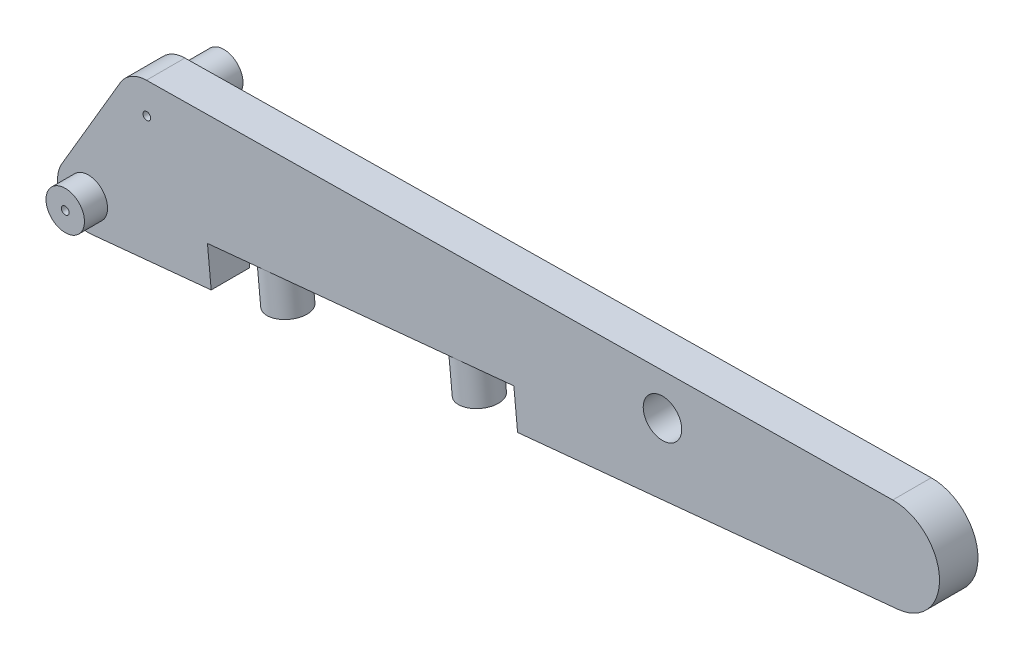
ISO-10303-21;
HEADER;
FILE_DESCRIPTION(('STEP AP214'),'2;1');
FILE_NAME('part.step','',(''),(''),'','','');
FILE_SCHEMA(('AUTOMOTIVE_DESIGN { 1 0 10303 214 1 1 1 1 }'));
ENDSEC;
DATA;
#1=APPLICATION_CONTEXT('core data for automotive mechanical design processes');
#2=APPLICATION_PROTOCOL_DEFINITION('international standard','automotive_design',2000,#1);
#3=PRODUCT_CONTEXT('',#1,'mechanical');
#4=PRODUCT('Part','Part','',(#3));
#5=PRODUCT_RELATED_PRODUCT_CATEGORY('part','',(#4));
#6=PRODUCT_DEFINITION_FORMATION('','',#4);
#7=PRODUCT_DEFINITION_CONTEXT('part definition',#1,'design');
#8=PRODUCT_DEFINITION('design','',#6,#7);
#9=PRODUCT_DEFINITION_SHAPE('','',#8);
#10=(LENGTH_UNIT() NAMED_UNIT(*) SI_UNIT(.MILLI.,.METRE.));
#11=(NAMED_UNIT(*) PLANE_ANGLE_UNIT() SI_UNIT($,.RADIAN.));
#12=(NAMED_UNIT(*) SI_UNIT($,.STERADIAN.) SOLID_ANGLE_UNIT());
#13=UNCERTAINTY_MEASURE_WITH_UNIT(LENGTH_MEASURE(1.E-05),#10,'distance_accuracy_value','');
#14=(GEOMETRIC_REPRESENTATION_CONTEXT(3) GLOBAL_UNCERTAINTY_ASSIGNED_CONTEXT((#13)) GLOBAL_UNIT_ASSIGNED_CONTEXT((#10,
#11,#12)) REPRESENTATION_CONTEXT('',''));
#15=CARTESIAN_POINT('',(0.,0.,0.));
#16=DIRECTION('',(0.,0.,1.));
#17=DIRECTION('',(1.,0.,0.));
#18=AXIS2_PLACEMENT_3D('',#15,#16,#17);
#19=CARTESIAN_POINT('',(47.6890944429912,-6.52502358700781,5.));
#20=DIRECTION('',(-0.0968281530487967,0.995301114626704,0.));
#21=DIRECTION('',(-0.995301114626704,-0.0968281530487967,0.));
#22=AXIS2_PLACEMENT_3D('',#19,#20,#21);
#23=PLANE('',#22);
#24=CARTESIAN_POINT('',(40.2243360832909,-7.25123473487379,2.5));
#25=DIRECTION('',(0.0968281530487967,-0.995301114626704,0.));
#26=DIRECTION('',(0.995301114626704,0.0968281530487967,0.));
#27=AXIS2_PLACEMENT_3D('',#24,#25,#26);
#28=CIRCLE('',#27,2.5);
#29=CARTESIAN_POINT('',(40.2243360832909,-7.25123473487379,0.));
#30=VERTEX_POINT('',#29);
#31=CARTESIAN_POINT('',(40.2243360832909,-7.25123473487379,5.));
#32=VERTEX_POINT('',#31);
#33=EDGE_CURVE('E146',#30,#32,#28,.T.);
#34=ORIENTED_EDGE('',*,*,#33,.F.);
#35=DIRECTION('',(0.995301114626704,0.0968281530487967,0.));
#36=VECTOR('',#35,1.);
#37=CARTESIAN_POINT('',(47.6890944429912,-6.52502358700781,0.));
#38=LINE('',#37,#36);
#39=CARTESIAN_POINT('',(47.6890944429912,-6.52502358700781,0.));
#40=VERTEX_POINT('',#39);
#41=EDGE_CURVE('E133',#30,#40,#38,.T.);
#42=ORIENTED_EDGE('',*,*,#41,.T.);
#43=DIRECTION('',(0.,0.,-1.));
#44=VECTOR('',#43,1.);
#45=CARTESIAN_POINT('',(47.6890944429912,-6.52502358700781,5.));
#46=LINE('',#45,#44);
#47=CARTESIAN_POINT('',(47.6890944429912,-6.52502358700781,5.));
#48=VERTEX_POINT('',#47);
#49=EDGE_CURVE('E182',#48,#40,#46,.T.);
#50=ORIENTED_EDGE('',*,*,#49,.F.);
#51=DIRECTION('',(0.995301114626704,0.0968281530487967,0.));
#52=VECTOR('',#51,1.);
#53=CARTESIAN_POINT('',(47.6890944429912,-6.52502358700781,5.));
#54=LINE('',#53,#52);
#55=EDGE_CURVE('E147',#32,#48,#54,.T.);
#56=ORIENTED_EDGE('',*,*,#55,.F.);
#57=EDGE_LOOP('',(#34,#42,#50,#56));
#58=FACE_BOUND('',#57,.T.);
#59=ADVANCED_FACE('F38',(#58),#23,.F.);
#60=EDGE_CURVE('E53',#32,#30,#28,.T.);
#61=ORIENTED_EDGE('',*,*,#60,.F.);
#62=CARTESIAN_POINT('',(15.3418082176233,-9.6719385610937,5.));
#63=VERTEX_POINT('',#62);
#64=EDGE_CURVE('E178',#63,#32,#54,.T.);
#65=ORIENTED_EDGE('',*,*,#64,.F.);
#66=CARTESIAN_POINT('',(15.3418082176233,-9.6719385610937,2.5));
#67=DIRECTION('',(-0.0968281530487967,0.995301114626704,0.));
#68=DIRECTION('',(-0.995301114626704,-0.0968281530487967,0.));
#69=AXIS2_PLACEMENT_3D('',#66,#67,#68);
#70=CIRCLE('',#69,2.5);
#71=CARTESIAN_POINT('',(15.3418082176233,-9.67193856109371,0.));
#72=VERTEX_POINT('',#71);
#73=EDGE_CURVE('E11',#72,#63,#70,.F.);
#74=ORIENTED_EDGE('',*,*,#73,.F.);
#75=EDGE_CURVE('E127',#72,#30,#38,.T.);
#76=ORIENTED_EDGE('',*,*,#75,.T.);
#77=EDGE_LOOP('',(#61,#65,#74,#76));
#78=FACE_BOUND('',#77,.T.);
#79=ADVANCED_FACE('F129',(#78),#23,.F.);
#80=CARTESIAN_POINT('',(97.5809689182928,-6.71860047068932,5.));
#81=DIRECTION('',(-0.0968281530487968,0.995301114626704,0.));
#82=DIRECTION('',(-0.995301114626704,-0.0968281530487968,0.));
#83=AXIS2_PLACEMENT_3D('',#80,#81,#82);
#84=PLANE('',#83);
#85=DIRECTION('',(0.995301114626704,0.0968281530487968,0.));
#86=VECTOR('',#85,1.);
#87=CARTESIAN_POINT('',(97.5809689182928,-6.71860047068932,5.));
#88=LINE('',#87,#86);
#89=CARTESIAN_POINT('',(48.1755208702595,-11.5250235870078,5.));
#90=VERTEX_POINT('',#89);
#91=CARTESIAN_POINT('',(97.5809689182928,-6.71860047068932,5.));
#92=VERTEX_POINT('',#91);
#93=EDGE_CURVE('E229',#90,#92,#88,.T.);
#94=ORIENTED_EDGE('',*,*,#93,.F.);
#95=DIRECTION('',(0.,0.,-1.));
#96=VECTOR('',#95,1.);
#97=CARTESIAN_POINT('',(48.1755208702595,-11.5250235870078,5.));
#98=LINE('',#97,#96);
#99=CARTESIAN_POINT('',(48.1755208702595,-11.5250235870078,0.));
#100=VERTEX_POINT('',#99);
#101=EDGE_CURVE('E177',#90,#100,#98,.T.);
#102=ORIENTED_EDGE('',*,*,#101,.T.);
#103=DIRECTION('',(0.995301114626704,0.0968281530487968,0.));
#104=VECTOR('',#103,1.);
#105=CARTESIAN_POINT('',(97.5809689182928,-6.71860047068932,0.));
#106=LINE('',#105,#104);
#107=CARTESIAN_POINT('',(97.5809689182928,-6.71860047068932,0.));
#108=VERTEX_POINT('',#107);
#109=EDGE_CURVE('E244',#100,#108,#106,.T.);
#110=ORIENTED_EDGE('',*,*,#109,.T.);
#111=DIRECTION('',(0.,0.,-1.));
#112=VECTOR('',#111,1.);
#113=CARTESIAN_POINT('',(97.5809689182928,-6.71860047068932,5.));
#114=LINE('',#113,#112);
#115=EDGE_CURVE('E256',#92,#108,#114,.T.);
#116=ORIENTED_EDGE('',*,*,#115,.F.);
#117=EDGE_LOOP('',(#94,#102,#110,#116));
#118=FACE_BOUND('',#117,.T.);
#119=ADVANCED_FACE('F299',(#118),#84,.F.);
#120=CARTESIAN_POINT('',(0.,0.,5.));
#121=DIRECTION('',(0.,0.,1.));
#122=DIRECTION('',(1.,0.,0.));
#123=AXIS2_PLACEMENT_3D('',#120,#121,#122);
#124=PLANE('',#123);
#125=DIRECTION('',(0.0968281530487984,-0.995301114626703,0.));
#126=VECTOR('',#125,1.);
#127=CARTESIAN_POINT('',(48.1755208702595,-11.5250235870078,5.));
#128=LINE('',#127,#126);
#129=EDGE_CURVE('E168',#48,#90,#128,.T.);
#130=ORIENTED_EDGE('',*,*,#129,.T.);
#131=ORIENTED_EDGE('',*,*,#93,.T.);
#132=CARTESIAN_POINT('',(97.,-0.746793782929099,5.));
#133=DIRECTION('',(0.,0.,1.));
#134=DIRECTION('',(1.,0.,0.));
#135=AXIS2_PLACEMENT_3D('',#132,#133,#134);
#136=CIRCLE('',#135,6.);
#137=CARTESIAN_POINT('',(96.9224782338776,5.25270539415037,5.));
#138=VERTEX_POINT('',#137);
#139=EDGE_CURVE('E233',#92,#138,#136,.T.);
#140=ORIENTED_EDGE('',*,*,#139,.T.);
#141=DIRECTION('',(-0.999916529513246,-0.0129202943537264,0.));
#142=VECTOR('',#141,1.);
#143=CARTESIAN_POINT('',(-0.0516811774149059,3.99966611805298,5.));
#144=LINE('',#143,#142);
#145=CARTESIAN_POINT('',(-0.0516811774149059,3.99966611805298,5.));
#146=VERTEX_POINT('',#145);
#147=EDGE_CURVE('E235',#138,#146,#144,.T.);
#148=ORIENTED_EDGE('',*,*,#147,.T.);
#149=CARTESIAN_POINT('',(0.,0.,5.));
#150=DIRECTION('',(0.,0.,1.));
#151=DIRECTION('',(1.,0.,0.));
#152=AXIS2_PLACEMENT_3D('',#149,#150,#151);
#153=CIRCLE('',#152,4.);
#154=CARTESIAN_POINT('',(-3.4486016019758,2.02660972830239,5.));
#155=VERTEX_POINT('',#154);
#156=EDGE_CURVE('E221',#146,#155,#153,.T.);
#157=ORIENTED_EDGE('',*,*,#156,.T.);
#158=DIRECTION('',(-0.506652432075599,-0.862150400493951,0.));
#159=VECTOR('',#158,1.);
#160=CARTESIAN_POINT('',(-11.0483880831098,-10.9056462791069,5.));
#161=LINE('',#160,#159);
#162=CARTESIAN_POINT('',(-11.0483880831098,-10.9056462791069,5.));
#163=VERTEX_POINT('',#162);
#164=EDGE_CURVE('E224',#155,#163,#161,.T.);
#165=ORIENTED_EDGE('',*,*,#164,.T.);
#166=CARTESIAN_POINT('',(-7.59978648113398,-12.9322560074093,5.));
#167=DIRECTION('',(0.,0.,1.));
#168=DIRECTION('',(1.,0.,0.));
#169=AXIS2_PLACEMENT_3D('',#166,#167,#168);
#170=CIRCLE('',#169,4.);
#171=CARTESIAN_POINT('',(-7.21247386893879,-16.9134604659161,5.));
#172=VERTEX_POINT('',#171);
#173=EDGE_CURVE('E227',#163,#172,#170,.T.);
#174=ORIENTED_EDGE('',*,*,#173,.T.);
#175=CARTESIAN_POINT('',(8.36347628519138,-15.3981497089597,5.));
#176=VERTEX_POINT('',#175);
#177=EDGE_CURVE('E230',#172,#176,#88,.T.);
#178=ORIENTED_EDGE('',*,*,#177,.T.);
#179=DIRECTION('',(-0.0968281530487964,0.995301114626704,0.));
#180=VECTOR('',#179,1.);
#181=CARTESIAN_POINT('',(8.3634762851913,-15.3981497089597,5.));
#182=LINE('',#181,#180);
#183=CARTESIAN_POINT('',(7.87704985792304,-10.3981497089597,5.));
#184=VERTEX_POINT('',#183);
#185=EDGE_CURVE('E171',#176,#184,#182,.T.);
#186=ORIENTED_EDGE('',*,*,#185,.T.);
#187=EDGE_CURVE('E174',#184,#63,#54,.T.);
#188=ORIENTED_EDGE('',*,*,#187,.T.);
#189=ORIENTED_EDGE('',*,*,#64,.T.);
#190=ORIENTED_EDGE('',*,*,#55,.T.);
#191=EDGE_LOOP('',(#130,#131,#140,#148,#157,#165,#174,#178,#186,#188,#189,#190));
#192=FACE_BOUND('',#191,.T.);
#193=CARTESIAN_POINT('',(67.,-0.515826633569584,5.));
#194=DIRECTION('',(0.,0.,-1.));
#195=DIRECTION('',(-1.,0.,0.));
#196=AXIS2_PLACEMENT_3D('',#193,#194,#195);
#197=CIRCLE('',#196,2.49999999999999);
#198=CARTESIAN_POINT('',(64.5,-0.515826633569584,5.));
#199=VERTEX_POINT('',#198);
#200=EDGE_CURVE('E191',#199,#199,#197,.T.);
#201=ORIENTED_EDGE('',*,*,#200,.T.);
#202=EDGE_LOOP('',(#201));
#203=FACE_BOUND('',#202,.T.);
#204=CARTESIAN_POINT('',(-7.59978648113398,-12.9322560074093,5.));
#205=DIRECTION('',(0.,0.,1.));
#206=DIRECTION('',(1.,0.,0.));
#207=AXIS2_PLACEMENT_3D('',#204,#205,#206);
#208=CIRCLE('',#207,2.5);
#209=CARTESIAN_POINT('',(-5.09978648113398,-12.9322560074093,5.));
#210=VERTEX_POINT('',#209);
#211=EDGE_CURVE('E217',#210,#210,#208,.T.);
#212=ORIENTED_EDGE('',*,*,#211,.F.);
#213=EDGE_LOOP('',(#212));
#214=FACE_BOUND('',#213,.T.);
#215=CARTESIAN_POINT('',(0.,0.,5.));
#216=DIRECTION('',(0.,0.,1.));
#217=DIRECTION('',(1.,0.,0.));
#218=AXIS2_PLACEMENT_3D('',#215,#216,#217);
#219=CIRCLE('',#218,0.5);
#220=CARTESIAN_POINT('',(0.5,0.,5.));
#221=VERTEX_POINT('',#220);
#222=EDGE_CURVE('E205',#221,#221,#219,.T.);
#223=ORIENTED_EDGE('',*,*,#222,.F.);
#224=EDGE_LOOP('',(#223));
#225=FACE_BOUND('',#224,.T.);
#226=ADVANCED_FACE('F287',(#192,#203,#214,#225),#124,.T.);
#227=CARTESIAN_POINT('',(0.,0.,0.));
#228=DIRECTION('',(0.,0.,1.));
#229=DIRECTION('',(1.,0.,0.));
#230=AXIS2_PLACEMENT_3D('',#227,#228,#229);
#231=PLANE('',#230);
#232=CARTESIAN_POINT('',(67.,-0.515826633569584,0.));
#233=DIRECTION('',(0.,0.,-1.));
#234=DIRECTION('',(-1.,0.,0.));
#235=AXIS2_PLACEMENT_3D('',#232,#233,#234);
#236=CIRCLE('',#235,2.49999999999999);
#237=CARTESIAN_POINT('',(64.5,-0.515826633569584,0.));
#238=VERTEX_POINT('',#237);
#239=EDGE_CURVE('E184',#238,#238,#236,.T.);
#240=ORIENTED_EDGE('',*,*,#239,.F.);
#241=EDGE_LOOP('',(#240));
#242=FACE_BOUND('',#241,.T.);
#243=ORIENTED_EDGE('',*,*,#109,.F.);
#244=DIRECTION('',(0.0968281530487984,-0.995301114626703,0.));
#245=VECTOR('',#244,1.);
#246=CARTESIAN_POINT('',(48.1755208702595,-11.5250235870078,0.));
#247=LINE('',#246,#245);
#248=EDGE_CURVE('E140',#40,#100,#247,.T.);
#249=ORIENTED_EDGE('',*,*,#248,.F.);
#250=ORIENTED_EDGE('',*,*,#41,.F.);
#251=ORIENTED_EDGE('',*,*,#75,.F.);
#252=CARTESIAN_POINT('',(7.87704985792304,-10.3981497089597,0.));
#253=VERTEX_POINT('',#252);
#254=EDGE_CURVE('E132',#253,#72,#38,.T.);
#255=ORIENTED_EDGE('',*,*,#254,.F.);
#256=DIRECTION('',(-0.0968281530487964,0.995301114626704,0.));
#257=VECTOR('',#256,1.);
#258=CARTESIAN_POINT('',(8.3634762851913,-15.3981497089597,0.));
#259=LINE('',#258,#257);
#260=CARTESIAN_POINT('',(8.3634762851913,-15.3981497089597,0.));
#261=VERTEX_POINT('',#260);
#262=EDGE_CURVE('E144',#261,#253,#259,.T.);
#263=ORIENTED_EDGE('',*,*,#262,.F.);
#264=CARTESIAN_POINT('',(-7.21247386893879,-16.9134604659161,0.));
#265=VERTEX_POINT('',#264);
#266=EDGE_CURVE('E245',#265,#261,#106,.T.);
#267=ORIENTED_EDGE('',*,*,#266,.F.);
#268=CARTESIAN_POINT('',(-7.59978648113398,-12.9322560074093,0.));
#269=DIRECTION('',(0.,0.,1.));
#270=DIRECTION('',(1.,0.,0.));
#271=AXIS2_PLACEMENT_3D('',#268,#269,#270);
#272=CIRCLE('',#271,4.);
#273=CARTESIAN_POINT('',(-11.0483880831098,-10.9056462791069,0.));
#274=VERTEX_POINT('',#273);
#275=EDGE_CURVE('E242',#274,#265,#272,.T.);
#276=ORIENTED_EDGE('',*,*,#275,.F.);
#277=DIRECTION('',(-0.506652432075599,-0.862150400493951,0.));
#278=VECTOR('',#277,1.);
#279=CARTESIAN_POINT('',(-11.0483880831098,-10.9056462791069,0.));
#280=LINE('',#279,#278);
#281=CARTESIAN_POINT('',(-3.4486016019758,2.02660972830239,0.));
#282=VERTEX_POINT('',#281);
#283=EDGE_CURVE('E240',#282,#274,#280,.T.);
#284=ORIENTED_EDGE('',*,*,#283,.F.);
#285=CARTESIAN_POINT('',(0.,0.,0.));
#286=DIRECTION('',(0.,0.,1.));
#287=DIRECTION('',(1.,0.,0.));
#288=AXIS2_PLACEMENT_3D('',#285,#286,#287);
#289=CIRCLE('',#288,4.);
#290=CARTESIAN_POINT('',(-0.0516811774149059,3.99966611805298,0.));
#291=VERTEX_POINT('',#290);
#292=EDGE_CURVE('E220',#291,#282,#289,.T.);
#293=ORIENTED_EDGE('',*,*,#292,.F.);
#294=DIRECTION('',(-0.999916529513246,-0.0129202943537264,0.));
#295=VECTOR('',#294,1.);
#296=CARTESIAN_POINT('',(-0.0516811774149059,3.99966611805298,0.));
#297=LINE('',#296,#295);
#298=CARTESIAN_POINT('',(96.9224782338776,5.25270539415037,0.));
#299=VERTEX_POINT('',#298);
#300=EDGE_CURVE('E225',#299,#291,#297,.T.);
#301=ORIENTED_EDGE('',*,*,#300,.F.);
#302=CARTESIAN_POINT('',(97.,-0.746793782929099,0.));
#303=DIRECTION('',(0.,0.,1.));
#304=DIRECTION('',(1.,0.,0.));
#305=AXIS2_PLACEMENT_3D('',#302,#303,#304);
#306=CIRCLE('',#305,6.);
#307=EDGE_CURVE('E248',#108,#299,#306,.T.);
#308=ORIENTED_EDGE('',*,*,#307,.F.);
#309=EDGE_LOOP('',(#243,#249,#250,#251,#255,#263,#267,#276,#284,#293,#301,#308));
#310=FACE_BOUND('',#309,.T.);
#311=CARTESIAN_POINT('',(0.,0.,0.));
#312=DIRECTION('',(0.,0.,1.));
#313=DIRECTION('',(1.,0.,0.));
#314=AXIS2_PLACEMENT_3D('',#311,#312,#313);
#315=CIRCLE('',#314,2.5);
#316=CARTESIAN_POINT('',(2.5,0.,0.));
#317=VERTEX_POINT('',#316);
#318=EDGE_CURVE('E214',#317,#317,#315,.T.);
#319=ORIENTED_EDGE('',*,*,#318,.T.);
#320=EDGE_LOOP('',(#319));
#321=FACE_BOUND('',#320,.T.);
#322=CARTESIAN_POINT('',(-7.59978648113398,-12.9322560074093,0.));
#323=DIRECTION('',(0.,0.,-1.));
#324=DIRECTION('',(-1.,0.,0.));
#325=AXIS2_PLACEMENT_3D('',#322,#323,#324);
#326=CIRCLE('',#325,0.500000000000001);
#327=CARTESIAN_POINT('',(-8.09978648113398,-12.9322560074093,0.));
#328=VERTEX_POINT('',#327);
#329=EDGE_CURVE('E194',#328,#328,#326,.T.);
#330=ORIENTED_EDGE('',*,*,#329,.F.);
#331=EDGE_LOOP('',(#330));
#332=FACE_BOUND('',#331,.T.);
#333=ADVANCED_FACE('F138',(#242,#310,#321,#332),#231,.F.);
#334=CARTESIAN_POINT('',(0.,0.,5.));
#335=DIRECTION('',(0.,0.,-1.));
#336=DIRECTION('',(-1.,0.,0.));
#337=AXIS2_PLACEMENT_3D('',#334,#335,#336);
#338=CYLINDRICAL_SURFACE('',#337,4.);
#339=ORIENTED_EDGE('',*,*,#292,.T.);
#340=DIRECTION('',(0.,0.,-1.));
#341=VECTOR('',#340,1.);
#342=CARTESIAN_POINT('',(-3.4486016019758,2.02660972830239,5.));
#343=LINE('',#342,#341);
#344=EDGE_CURVE('E46',#155,#282,#343,.T.);
#345=ORIENTED_EDGE('',*,*,#344,.F.);
#346=ORIENTED_EDGE('',*,*,#156,.F.);
#347=DIRECTION('',(0.,0.,-1.));
#348=VECTOR('',#347,1.);
#349=CARTESIAN_POINT('',(-0.0516811774149059,3.99966611805298,5.));
#350=LINE('',#349,#348);
#351=EDGE_CURVE('E237',#146,#291,#350,.T.);
#352=ORIENTED_EDGE('',*,*,#351,.T.);
#353=EDGE_LOOP('',(#339,#345,#346,#352));
#354=FACE_BOUND('',#353,.T.);
#355=ADVANCED_FACE('F40',(#354),#338,.T.);
#356=CARTESIAN_POINT('',(-11.0483880831098,-10.9056462791069,5.));
#357=DIRECTION('',(0.862150400493951,-0.506652432075599,0.));
#358=DIRECTION('',(0.506652432075599,0.862150400493952,0.));
#359=AXIS2_PLACEMENT_3D('',#356,#357,#358);
#360=PLANE('',#359);
#361=ORIENTED_EDGE('',*,*,#283,.T.);
#362=DIRECTION('',(0.,0.,-1.));
#363=VECTOR('',#362,1.);
#364=CARTESIAN_POINT('',(-11.0483880831098,-10.9056462791069,5.));
#365=LINE('',#364,#363);
#366=EDGE_CURVE('E262',#163,#274,#365,.T.);
#367=ORIENTED_EDGE('',*,*,#366,.F.);
#368=ORIENTED_EDGE('',*,*,#164,.F.);
#369=ORIENTED_EDGE('',*,*,#344,.T.);
#370=EDGE_LOOP('',(#361,#367,#368,#369));
#371=FACE_BOUND('',#370,.T.);
#372=ADVANCED_FACE('F267',(#371),#360,.F.);
#373=CARTESIAN_POINT('',(-7.59978648113398,-12.9322560074093,5.));
#374=DIRECTION('',(0.,0.,-1.));
#375=DIRECTION('',(-1.,0.,0.));
#376=AXIS2_PLACEMENT_3D('',#373,#374,#375);
#377=CYLINDRICAL_SURFACE('',#376,4.);
#378=ORIENTED_EDGE('',*,*,#275,.T.);
#379=DIRECTION('',(0.,0.,-1.));
#380=VECTOR('',#379,1.);
#381=CARTESIAN_POINT('',(-7.21247386893879,-16.9134604659161,5.));
#382=LINE('',#381,#380);
#383=EDGE_CURVE('E259',#172,#265,#382,.T.);
#384=ORIENTED_EDGE('',*,*,#383,.F.);
#385=ORIENTED_EDGE('',*,*,#173,.F.);
#386=ORIENTED_EDGE('',*,*,#366,.T.);
#387=EDGE_LOOP('',(#378,#384,#385,#386));
#388=FACE_BOUND('',#387,.T.);
#389=ADVANCED_FACE('F280',(#388),#377,.T.);
#390=ORIENTED_EDGE('',*,*,#266,.T.);
#391=DIRECTION('',(0.,0.,-1.));
#392=VECTOR('',#391,1.);
#393=CARTESIAN_POINT('',(8.3634762851913,-15.3981497089597,5.));
#394=LINE('',#393,#392);
#395=EDGE_CURVE('E187',#176,#261,#394,.T.);
#396=ORIENTED_EDGE('',*,*,#395,.F.);
#397=ORIENTED_EDGE('',*,*,#177,.F.);
#398=ORIENTED_EDGE('',*,*,#383,.T.);
#399=EDGE_LOOP('',(#390,#396,#397,#398));
#400=FACE_BOUND('',#399,.T.);
#401=ADVANCED_FACE('F284',(#400),#84,.F.);
#402=CARTESIAN_POINT('',(97.,-0.746793782929099,5.));
#403=DIRECTION('',(0.,0.,-1.));
#404=DIRECTION('',(-1.,0.,0.));
#405=AXIS2_PLACEMENT_3D('',#402,#403,#404);
#406=CYLINDRICAL_SURFACE('',#405,6.);
#407=ORIENTED_EDGE('',*,*,#307,.T.);
#408=DIRECTION('',(0.,0.,-1.));
#409=VECTOR('',#408,1.);
#410=CARTESIAN_POINT('',(96.9224782338776,5.25270539415037,5.));
#411=LINE('',#410,#409);
#412=EDGE_CURVE('E253',#138,#299,#411,.T.);
#413=ORIENTED_EDGE('',*,*,#412,.F.);
#414=ORIENTED_EDGE('',*,*,#139,.F.);
#415=ORIENTED_EDGE('',*,*,#115,.T.);
#416=EDGE_LOOP('',(#407,#413,#414,#415));
#417=FACE_BOUND('',#416,.T.);
#418=ADVANCED_FACE('F295',(#417),#406,.T.);
#419=CARTESIAN_POINT('',(-0.0516811774149059,3.99966611805298,5.));
#420=DIRECTION('',(0.0129202943537264,-0.999916529513245,0.));
#421=DIRECTION('',(0.999916529513246,0.0129202943537264,0.));
#422=AXIS2_PLACEMENT_3D('',#419,#420,#421);
#423=PLANE('',#422);
#424=ORIENTED_EDGE('',*,*,#300,.T.);
#425=ORIENTED_EDGE('',*,*,#351,.F.);
#426=ORIENTED_EDGE('',*,*,#147,.F.);
#427=ORIENTED_EDGE('',*,*,#412,.T.);
#428=EDGE_LOOP('',(#424,#425,#426,#427));
#429=FACE_BOUND('',#428,.T.);
#430=ADVANCED_FACE('F293',(#429),#423,.F.);
#431=CARTESIAN_POINT('',(0.,0.,-5.));
#432=DIRECTION('',(0.,0.,1.));
#433=DIRECTION('',(1.,0.,0.));
#434=AXIS2_PLACEMENT_3D('',#431,#432,#433);
#435=CYLINDRICAL_SURFACE('',#434,2.5);
#436=CARTESIAN_POINT('',(0.,0.,-5.));
#437=DIRECTION('',(0.,0.,1.));
#438=DIRECTION('',(1.,0.,0.));
#439=AXIS2_PLACEMENT_3D('',#436,#437,#438);
#440=CIRCLE('',#439,2.5);
#441=CARTESIAN_POINT('',(2.5,0.,-5.));
#442=VERTEX_POINT('',#441);
#443=EDGE_CURVE('E209',#442,#442,#440,.T.);
#444=ORIENTED_EDGE('',*,*,#443,.T.);
#445=EDGE_LOOP('',(#444));
#446=FACE_BOUND('',#445,.T.);
#447=ORIENTED_EDGE('',*,*,#318,.F.);
#448=EDGE_LOOP('',(#447));
#449=FACE_BOUND('',#448,.T.);
#450=ADVANCED_FACE('F501',(#446,#449),#435,.T.);
#451=CARTESIAN_POINT('',(0.,0.,-5.));
#452=DIRECTION('',(0.,0.,1.));
#453=DIRECTION('',(1.,0.,0.));
#454=AXIS2_PLACEMENT_3D('',#451,#452,#453);
#455=PLANE('',#454);
#456=CARTESIAN_POINT('',(0.,0.,-5.));
#457=DIRECTION('',(0.,0.,1.));
#458=DIRECTION('',(1.,0.,0.));
#459=AXIS2_PLACEMENT_3D('',#456,#457,#458);
#460=CIRCLE('',#459,0.5);
#461=CARTESIAN_POINT('',(0.5,0.,-5.));
#462=VERTEX_POINT('',#461);
#463=EDGE_CURVE('E206',#462,#462,#460,.T.);
#464=ORIENTED_EDGE('',*,*,#463,.T.);
#465=EDGE_LOOP('',(#464));
#466=FACE_BOUND('',#465,.T.);
#467=ORIENTED_EDGE('',*,*,#443,.F.);
#468=EDGE_LOOP('',(#467));
#469=FACE_BOUND('',#468,.T.);
#470=ADVANCED_FACE('F492',(#466,#469),#455,.F.);
#471=CARTESIAN_POINT('',(0.,0.,-5.));
#472=DIRECTION('',(0.,0.,1.));
#473=DIRECTION('',(1.,0.,0.));
#474=AXIS2_PLACEMENT_3D('',#471,#472,#473);
#475=CYLINDRICAL_SURFACE('',#474,0.5);
#476=ORIENTED_EDGE('',*,*,#463,.F.);
#477=EDGE_LOOP('',(#476));
#478=FACE_BOUND('',#477,.T.);
#479=ORIENTED_EDGE('',*,*,#222,.T.);
#480=EDGE_LOOP('',(#479));
#481=FACE_BOUND('',#480,.T.);
#482=ADVANCED_FACE('F470',(#478,#481),#475,.F.);
#483=CARTESIAN_POINT('',(-7.59978648113398,-12.9322560074093,8.));
#484=DIRECTION('',(0.,0.,-1.));
#485=DIRECTION('',(-1.,0.,0.));
#486=AXIS2_PLACEMENT_3D('',#483,#484,#485);
#487=CYLINDRICAL_SURFACE('',#486,2.5);
#488=ORIENTED_EDGE('',*,*,#211,.T.);
#489=EDGE_LOOP('',(#488));
#490=FACE_BOUND('',#489,.T.);
#491=CARTESIAN_POINT('',(-7.59978648113398,-12.9322560074093,8.));
#492=DIRECTION('',(0.,0.,-1.));
#493=DIRECTION('',(-1.,0.,0.));
#494=AXIS2_PLACEMENT_3D('',#491,#492,#493);
#495=CIRCLE('',#494,2.5);
#496=CARTESIAN_POINT('',(-10.099786481134,-12.9322560074093,8.));
#497=VERTEX_POINT('',#496);
#498=EDGE_CURVE('E200',#497,#497,#495,.T.);
#499=ORIENTED_EDGE('',*,*,#498,.T.);
#500=EDGE_LOOP('',(#499));
#501=FACE_BOUND('',#500,.T.);
#502=ADVANCED_FACE('F461',(#490,#501),#487,.T.);
#503=CARTESIAN_POINT('',(-7.59978648113398,-12.9322560074093,8.));
#504=DIRECTION('',(0.,0.,-1.));
#505=DIRECTION('',(-1.,0.,0.));
#506=AXIS2_PLACEMENT_3D('',#503,#504,#505);
#507=PLANE('',#506);
#508=CARTESIAN_POINT('',(-7.59978648113398,-12.9322560074093,8.));
#509=DIRECTION('',(0.,0.,-1.));
#510=DIRECTION('',(-1.,0.,0.));
#511=AXIS2_PLACEMENT_3D('',#508,#509,#510);
#512=CIRCLE('',#511,0.500000000000001);
#513=CARTESIAN_POINT('',(-8.09978648113398,-12.9322560074093,8.));
#514=VERTEX_POINT('',#513);
#515=EDGE_CURVE('E197',#514,#514,#512,.T.);
#516=ORIENTED_EDGE('',*,*,#515,.T.);
#517=EDGE_LOOP('',(#516));
#518=FACE_BOUND('',#517,.T.);
#519=ORIENTED_EDGE('',*,*,#498,.F.);
#520=EDGE_LOOP('',(#519));
#521=FACE_BOUND('',#520,.T.);
#522=ADVANCED_FACE('F452',(#518,#521),#507,.F.);
#523=CARTESIAN_POINT('',(-7.59978648113398,-12.9322560074093,8.));
#524=DIRECTION('',(0.,0.,-1.));
#525=DIRECTION('',(-1.,0.,0.));
#526=AXIS2_PLACEMENT_3D('',#523,#524,#525);
#527=CYLINDRICAL_SURFACE('',#526,0.500000000000001);
#528=ORIENTED_EDGE('',*,*,#515,.F.);
#529=EDGE_LOOP('',(#528));
#530=FACE_BOUND('',#529,.T.);
#531=ORIENTED_EDGE('',*,*,#329,.T.);
#532=EDGE_LOOP('',(#531));
#533=FACE_BOUND('',#532,.T.);
#534=ADVANCED_FACE('F443',(#530,#533),#527,.F.);
#535=CARTESIAN_POINT('',(67.,-0.515826633569584,5.));
#536=DIRECTION('',(0.,0.,-1.));
#537=DIRECTION('',(-1.,0.,0.));
#538=AXIS2_PLACEMENT_3D('',#535,#536,#537);
#539=CYLINDRICAL_SURFACE('',#538,2.49999999999999);
#540=ORIENTED_EDGE('',*,*,#200,.F.);
#541=EDGE_LOOP('',(#540));
#542=FACE_BOUND('',#541,.T.);
#543=ORIENTED_EDGE('',*,*,#239,.T.);
#544=EDGE_LOOP('',(#543));
#545=FACE_BOUND('',#544,.T.);
#546=ADVANCED_FACE('F338',(#542,#545),#539,.F.);
#547=CARTESIAN_POINT('',(48.1755208702595,-11.5250235870078,5.));
#548=DIRECTION('',(0.995301114626704,0.0968281530487984,0.));
#549=DIRECTION('',(-0.0968281530487984,0.995301114626704,0.));
#550=AXIS2_PLACEMENT_3D('',#547,#548,#549);
#551=PLANE('',#550);
#552=ORIENTED_EDGE('',*,*,#248,.T.);
#553=ORIENTED_EDGE('',*,*,#101,.F.);
#554=ORIENTED_EDGE('',*,*,#129,.F.);
#555=ORIENTED_EDGE('',*,*,#49,.T.);
#556=EDGE_LOOP('',(#552,#553,#554,#555));
#557=FACE_BOUND('',#556,.T.);
#558=ADVANCED_FACE('F302',(#557),#551,.F.);
#559=CARTESIAN_POINT('',(15.3418082176233,-9.67193856109371,2.5));
#560=DIRECTION('',(0.0968281530487967,-0.995301114626704,0.));
#561=DIRECTION('',(0.995301114626704,0.0968281530487967,0.));
#562=AXIS2_PLACEMENT_3D('',#559,#560,#561);
#563=CIRCLE('',#562,2.5);
#564=EDGE_CURVE('E61',#63,#72,#563,.T.);
#565=ORIENTED_EDGE('',*,*,#564,.F.);
#566=ORIENTED_EDGE('',*,*,#187,.F.);
#567=DIRECTION('',(0.,0.,-1.));
#568=VECTOR('',#567,1.);
#569=CARTESIAN_POINT('',(7.87704985792304,-10.3981497089597,5.));
#570=LINE('',#569,#568);
#571=EDGE_CURVE('E185',#184,#253,#570,.T.);
#572=ORIENTED_EDGE('',*,*,#571,.T.);
#573=ORIENTED_EDGE('',*,*,#254,.T.);
#574=EDGE_LOOP('',(#565,#566,#572,#573));
#575=FACE_BOUND('',#574,.T.);
#576=ADVANCED_FACE('F324',(#575),#23,.F.);
#577=CARTESIAN_POINT('',(8.3634762851913,-15.3981497089597,5.));
#578=DIRECTION('',(-0.995301114626704,-0.0968281530487964,0.));
#579=DIRECTION('',(0.0968281530487964,-0.995301114626704,0.));
#580=AXIS2_PLACEMENT_3D('',#577,#578,#579);
#581=PLANE('',#580);
#582=ORIENTED_EDGE('',*,*,#262,.T.);
#583=ORIENTED_EDGE('',*,*,#571,.F.);
#584=ORIENTED_EDGE('',*,*,#185,.F.);
#585=ORIENTED_EDGE('',*,*,#395,.T.);
#586=EDGE_LOOP('',(#582,#583,#584,#585));
#587=FACE_BOUND('',#586,.T.);
#588=ADVANCED_FACE('F317',(#587),#581,.F.);
#589=CARTESIAN_POINT('',(15.8259489828673,-14.6484441342272,2.5));
#590=DIRECTION('',(0.0968281530487967,-0.995301114626704,0.));
#591=DIRECTION('',(0.995301114626704,0.0968281530487967,0.));
#592=AXIS2_PLACEMENT_3D('',#589,#590,#591);
#593=PLANE('',#592);
#594=CARTESIAN_POINT('',(15.8259489828673,-14.6484441342272,2.5));
#595=DIRECTION('',(0.0968281530487967,-0.995301114626704,0.));
#596=DIRECTION('',(0.995301114626704,0.0968281530487967,0.));
#597=AXIS2_PLACEMENT_3D('',#594,#595,#596);
#598=CIRCLE('',#597,2.5);
#599=CARTESIAN_POINT('',(18.3142017694341,-14.4063737516052,2.5));
#600=VERTEX_POINT('',#599);
#601=EDGE_CURVE('E164',#600,#600,#598,.T.);
#602=ORIENTED_EDGE('',*,*,#601,.T.);
#603=EDGE_LOOP('',(#602));
#604=FACE_BOUND('',#603,.T.);
#605=CARTESIAN_POINT('',(15.8259489828673,-14.6484441342272,2.5));
#606=DIRECTION('',(0.0968281530487967,-0.995301114626704,0.));
#607=DIRECTION('',(0.995301114626704,0.0968281530487967,0.));
#608=AXIS2_PLACEMENT_3D('',#605,#606,#607);
#609=CIRCLE('',#608,0.499999999999997);
#610=CARTESIAN_POINT('',(16.3235995401806,-14.6000300577028,2.5));
#611=VERTEX_POINT('',#610);
#612=EDGE_CURVE('E159',#611,#611,#609,.T.);
#613=ORIENTED_EDGE('',*,*,#612,.F.);
#614=EDGE_LOOP('',(#613));
#615=FACE_BOUND('',#614,.T.);
#616=ADVANCED_FACE('F307',(#604,#615),#593,.T.);
#617=CARTESIAN_POINT('',(15.8259489828673,-14.6484441342272,2.5));
#618=DIRECTION('',(-0.0968281530487967,0.995301114626704,0.));
#619=DIRECTION('',(-0.995301114626704,-0.0968281530487967,0.));
#620=AXIS2_PLACEMENT_3D('',#617,#618,#619);
#621=CYLINDRICAL_SURFACE('',#620,2.5);
#622=ORIENTED_EDGE('',*,*,#601,.F.);
#623=EDGE_LOOP('',(#622));
#624=FACE_BOUND('',#623,.T.);
#625=ORIENTED_EDGE('',*,*,#564,.T.);
#626=ORIENTED_EDGE('',*,*,#73,.T.);
#627=EDGE_LOOP('',(#625,#626));
#628=FACE_BOUND('',#627,.T.);
#629=ADVANCED_FACE('F304',(#624,#628),#621,.T.);
#630=CARTESIAN_POINT('',(15.8259489828673,-14.6484441342272,2.5));
#631=DIRECTION('',(-0.0968281530487967,0.995301114626704,0.));
#632=DIRECTION('',(-0.995301114626704,-0.0968281530487967,0.));
#633=AXIS2_PLACEMENT_3D('',#630,#631,#632);
#634=CYLINDRICAL_SURFACE('',#633,0.499999999999997);
#635=ORIENTED_EDGE('',*,*,#612,.T.);
#636=EDGE_LOOP('',(#635));
#637=FACE_BOUND('',#636,.T.);
#638=CARTESIAN_POINT('',(15.3418082176233,-9.67193856109371,2.5));
#639=DIRECTION('',(0.0968281530487967,-0.995301114626704,0.));
#640=DIRECTION('',(0.995301114626704,0.0968281530487967,0.));
#641=AXIS2_PLACEMENT_3D('',#638,#639,#640);
#642=CIRCLE('',#641,0.499999999999997);
#643=CARTESIAN_POINT('',(15.8394587749367,-9.62352448456931,2.5));
#644=VERTEX_POINT('',#643);
#645=EDGE_CURVE('E155',#644,#644,#642,.T.);
#646=ORIENTED_EDGE('',*,*,#645,.F.);
#647=EDGE_LOOP('',(#646));
#648=FACE_BOUND('',#647,.T.);
#649=ADVANCED_FACE('F306',(#637,#648),#634,.F.);
#650=ORIENTED_EDGE('',*,*,#645,.T.);
#651=EDGE_LOOP('',(#650));
#652=FACE_BOUND('',#651,.T.);
#653=ADVANCED_FACE('F314',(#652),#23,.F.);
#654=CARTESIAN_POINT('',(40.7084768485349,-12.2277403080073,2.5));
#655=DIRECTION('',(0.0968281530487967,-0.995301114626704,0.));
#656=DIRECTION('',(0.995301114626704,0.0968281530487967,0.));
#657=AXIS2_PLACEMENT_3D('',#654,#655,#656);
#658=PLANE('',#657);
#659=CARTESIAN_POINT('',(40.7084768485349,-12.2277403080073,2.5));
#660=DIRECTION('',(0.0968281530487967,-0.995301114626704,0.));
#661=DIRECTION('',(0.995301114626704,0.0968281530487967,0.));
#662=AXIS2_PLACEMENT_3D('',#659,#660,#661);
#663=CIRCLE('',#662,2.5);
#664=CARTESIAN_POINT('',(43.1967296351017,-11.9856699253853,2.5));
#665=VERTEX_POINT('',#664);
#666=EDGE_CURVE('E153',#665,#665,#663,.T.);
#667=ORIENTED_EDGE('',*,*,#666,.T.);
#668=EDGE_LOOP('',(#667));
#669=FACE_BOUND('',#668,.T.);
#670=CARTESIAN_POINT('',(40.7084768485349,-12.2277403080073,2.5));
#671=DIRECTION('',(0.0968281530487967,-0.995301114626704,0.));
#672=DIRECTION('',(0.995301114626704,0.0968281530487967,0.));
#673=AXIS2_PLACEMENT_3D('',#670,#671,#672);
#674=CIRCLE('',#673,0.500000000000002);
#675=CARTESIAN_POINT('',(41.2061274058482,-12.1793262314829,2.5));
#676=VERTEX_POINT('',#675);
#677=EDGE_CURVE('E150',#676,#676,#674,.T.);
#678=ORIENTED_EDGE('',*,*,#677,.F.);
#679=EDGE_LOOP('',(#678));
#680=FACE_BOUND('',#679,.T.);
#681=ADVANCED_FACE('F341',(#669,#680),#658,.T.);
#682=CARTESIAN_POINT('',(40.7084768485349,-12.2277403080073,2.5));
#683=DIRECTION('',(-0.0968281530487967,0.995301114626704,0.));
#684=DIRECTION('',(-0.995301114626704,-0.0968281530487967,0.));
#685=AXIS2_PLACEMENT_3D('',#682,#683,#684);
#686=CYLINDRICAL_SURFACE('',#685,2.5);
#687=ORIENTED_EDGE('',*,*,#666,.F.);
#688=EDGE_LOOP('',(#687));
#689=FACE_BOUND('',#688,.T.);
#690=ORIENTED_EDGE('',*,*,#60,.T.);
#691=ORIENTED_EDGE('',*,*,#33,.T.);
#692=EDGE_LOOP('',(#690,#691));
#693=FACE_BOUND('',#692,.T.);
#694=ADVANCED_FACE('F152',(#689,#693),#686,.T.);
#695=CARTESIAN_POINT('',(40.7084768485349,-12.2277403080073,2.5));
#696=DIRECTION('',(-0.0968281530487967,0.995301114626704,0.));
#697=DIRECTION('',(-0.995301114626704,-0.0968281530487967,0.));
#698=AXIS2_PLACEMENT_3D('',#695,#696,#697);
#699=CYLINDRICAL_SURFACE('',#698,0.500000000000002);
#700=ORIENTED_EDGE('',*,*,#677,.T.);
#701=EDGE_LOOP('',(#700));
#702=FACE_BOUND('',#701,.T.);
#703=CARTESIAN_POINT('',(40.2243360832909,-7.25123473487379,2.5));
#704=DIRECTION('',(0.0968281530487967,-0.995301114626704,0.));
#705=DIRECTION('',(0.995301114626704,0.0968281530487967,0.));
#706=AXIS2_PLACEMENT_3D('',#703,#704,#705);
#707=CIRCLE('',#706,0.500000000000002);
#708=CARTESIAN_POINT('',(40.7219866406042,-7.2028206583494,2.5));
#709=VERTEX_POINT('',#708);
#710=EDGE_CURVE('E366',#709,#709,#707,.T.);
#711=ORIENTED_EDGE('',*,*,#710,.F.);
#712=EDGE_LOOP('',(#711));
#713=FACE_BOUND('',#712,.T.);
#714=ADVANCED_FACE('F330',(#702,#713),#699,.F.);
#715=ORIENTED_EDGE('',*,*,#710,.T.);
#716=EDGE_LOOP('',(#715));
#717=FACE_BOUND('',#716,.T.);
#718=ADVANCED_FACE('F323',(#717),#23,.F.);
#719=CLOSED_SHELL('',(#59,#79,#119,#226,#333,#355,#372,#389,#401,#418,#430,#450,#470,#482,#502,
#522,#534,#546,#558,#576,#588,#616,#629,#649,#653,#681,#694,#714,#718));
#720=MANIFOLD_SOLID_BREP('B2',#719);
#721=ADVANCED_BREP_SHAPE_REPRESENTATION('',(#18,#720),#14);
#722=SHAPE_DEFINITION_REPRESENTATION(#9,#721);
ENDSEC;
END-ISO-10303-21;
